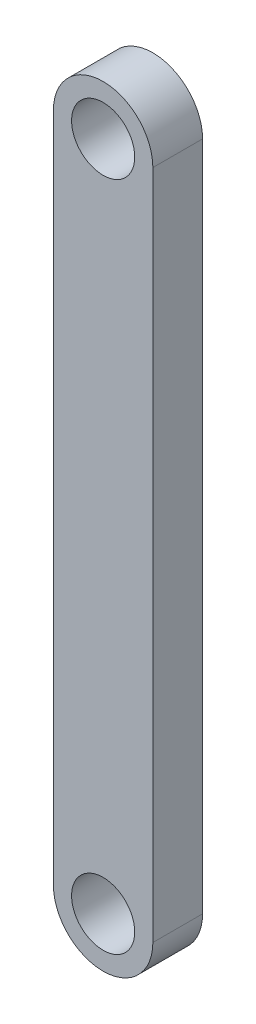
ISO-10303-21;
HEADER;
FILE_DESCRIPTION(('STEP AP214'),'2;1');
FILE_NAME('part.step','',(''),(''),'','','');
FILE_SCHEMA(('AUTOMOTIVE_DESIGN { 1 0 10303 214 1 1 1 1 }'));
ENDSEC;
DATA;
#1=APPLICATION_CONTEXT('core data for automotive mechanical design processes');
#2=APPLICATION_PROTOCOL_DEFINITION('international standard','automotive_design',2000,#1);
#3=PRODUCT_CONTEXT('',#1,'mechanical');
#4=PRODUCT('Part','Part','',(#3));
#5=PRODUCT_RELATED_PRODUCT_CATEGORY('part','',(#4));
#6=PRODUCT_DEFINITION_FORMATION('','',#4);
#7=PRODUCT_DEFINITION_CONTEXT('part definition',#1,'design');
#8=PRODUCT_DEFINITION('design','',#6,#7);
#9=PRODUCT_DEFINITION_SHAPE('','',#8);
#10=(LENGTH_UNIT() NAMED_UNIT(*) SI_UNIT(.MILLI.,.METRE.));
#11=(NAMED_UNIT(*) PLANE_ANGLE_UNIT() SI_UNIT($,.RADIAN.));
#12=(NAMED_UNIT(*) SI_UNIT($,.STERADIAN.) SOLID_ANGLE_UNIT());
#13=UNCERTAINTY_MEASURE_WITH_UNIT(LENGTH_MEASURE(1.E-05),#10,'distance_accuracy_value','');
#14=(GEOMETRIC_REPRESENTATION_CONTEXT(3) GLOBAL_UNCERTAINTY_ASSIGNED_CONTEXT((#13)) GLOBAL_UNIT_ASSIGNED_CONTEXT((#10,
#11,#12)) REPRESENTATION_CONTEXT('',''));
#15=CARTESIAN_POINT('',(0.,0.,0.));
#16=DIRECTION('',(0.,0.,1.));
#17=DIRECTION('',(1.,0.,0.));
#18=AXIS2_PLACEMENT_3D('',#15,#16,#17);
#19=CARTESIAN_POINT('',(0.,0.,10.));
#20=DIRECTION('',(0.,0.,-1.));
#21=DIRECTION('',(-1.,0.,0.));
#22=AXIS2_PLACEMENT_3D('',#19,#20,#21);
#23=CYLINDRICAL_SURFACE('',#22,10.);
#24=CARTESIAN_POINT('',(0.,0.,0.));
#25=DIRECTION('',(0.,0.,1.));
#26=DIRECTION('',(1.,0.,0.));
#27=AXIS2_PLACEMENT_3D('',#24,#25,#26);
#28=CIRCLE('',#27,10.);
#29=CARTESIAN_POINT('',(-10.,0.,0.));
#30=VERTEX_POINT('',#29);
#31=CARTESIAN_POINT('',(10.,0.,0.));
#32=VERTEX_POINT('',#31);
#33=EDGE_CURVE('E96',#30,#32,#28,.T.);
#34=ORIENTED_EDGE('',*,*,#33,.T.);
#35=DIRECTION('',(0.,0.,-1.));
#36=VECTOR('',#35,1.);
#37=CARTESIAN_POINT('',(10.,0.,10.));
#38=LINE('',#37,#36);
#39=CARTESIAN_POINT('',(10.,0.,10.));
#40=VERTEX_POINT('',#39);
#41=EDGE_CURVE('E11',#40,#32,#38,.T.);
#42=ORIENTED_EDGE('',*,*,#41,.F.);
#43=CARTESIAN_POINT('',(0.,0.,10.));
#44=DIRECTION('',(0.,0.,1.));
#45=DIRECTION('',(1.,0.,0.));
#46=AXIS2_PLACEMENT_3D('',#43,#44,#45);
#47=CIRCLE('',#46,10.);
#48=CARTESIAN_POINT('',(-10.,0.,10.));
#49=VERTEX_POINT('',#48);
#50=EDGE_CURVE('E84',#49,#40,#47,.T.);
#51=ORIENTED_EDGE('',*,*,#50,.F.);
#52=DIRECTION('',(0.,0.,-1.));
#53=VECTOR('',#52,1.);
#54=CARTESIAN_POINT('',(-10.,0.,10.));
#55=LINE('',#54,#53);
#56=EDGE_CURVE('E92',#49,#30,#55,.T.);
#57=ORIENTED_EDGE('',*,*,#56,.T.);
#58=EDGE_LOOP('',(#34,#42,#51,#57));
#59=FACE_BOUND('',#58,.T.);
#60=ADVANCED_FACE('F33',(#59),#23,.T.);
#61=CARTESIAN_POINT('',(10.,0.,10.));
#62=DIRECTION('',(-1.,0.,0.));
#63=DIRECTION('',(0.,0.,1.));
#64=AXIS2_PLACEMENT_3D('',#61,#62,#63);
#65=PLANE('',#64);
#66=DIRECTION('',(0.,1.,0.));
#67=VECTOR('',#66,1.);
#68=CARTESIAN_POINT('',(10.,0.,0.));
#69=LINE('',#68,#67);
#70=CARTESIAN_POINT('',(10.,135.,0.));
#71=VERTEX_POINT('',#70);
#72=EDGE_CURVE('E88',#32,#71,#69,.T.);
#73=ORIENTED_EDGE('',*,*,#72,.T.);
#74=DIRECTION('',(0.,0.,-1.));
#75=VECTOR('',#74,1.);
#76=CARTESIAN_POINT('',(10.,135.,10.));
#77=LINE('',#76,#75);
#78=CARTESIAN_POINT('',(10.,135.,10.));
#79=VERTEX_POINT('',#78);
#80=EDGE_CURVE('E41',#79,#71,#77,.T.);
#81=ORIENTED_EDGE('',*,*,#80,.F.);
#82=DIRECTION('',(0.,1.,0.));
#83=VECTOR('',#82,1.);
#84=CARTESIAN_POINT('',(10.,0.,10.));
#85=LINE('',#84,#83);
#86=EDGE_CURVE('E79',#40,#79,#85,.T.);
#87=ORIENTED_EDGE('',*,*,#86,.F.);
#88=ORIENTED_EDGE('',*,*,#41,.T.);
#89=EDGE_LOOP('',(#73,#81,#87,#88));
#90=FACE_BOUND('',#89,.T.);
#91=ADVANCED_FACE('F87',(#90),#65,.F.);
#92=CARTESIAN_POINT('',(0.,135.,10.));
#93=DIRECTION('',(0.,0.,-1.));
#94=DIRECTION('',(-1.,0.,0.));
#95=AXIS2_PLACEMENT_3D('',#92,#93,#94);
#96=CYLINDRICAL_SURFACE('',#95,10.);
#97=CARTESIAN_POINT('',(0.,135.,0.));
#98=DIRECTION('',(0.,0.,1.));
#99=DIRECTION('',(1.,0.,0.));
#100=AXIS2_PLACEMENT_3D('',#97,#98,#99);
#101=CIRCLE('',#100,10.);
#102=CARTESIAN_POINT('',(-10.,135.,0.));
#103=VERTEX_POINT('',#102);
#104=EDGE_CURVE('E66',#71,#103,#101,.T.);
#105=ORIENTED_EDGE('',*,*,#104,.T.);
#106=DIRECTION('',(0.,0.,-1.));
#107=VECTOR('',#106,1.);
#108=CARTESIAN_POINT('',(-10.,135.,10.));
#109=LINE('',#108,#107);
#110=CARTESIAN_POINT('',(-10.,135.,10.));
#111=VERTEX_POINT('',#110);
#112=EDGE_CURVE('E89',#111,#103,#109,.T.);
#113=ORIENTED_EDGE('',*,*,#112,.F.);
#114=CARTESIAN_POINT('',(0.,135.,10.));
#115=DIRECTION('',(0.,0.,1.));
#116=DIRECTION('',(1.,0.,0.));
#117=AXIS2_PLACEMENT_3D('',#114,#115,#116);
#118=CIRCLE('',#117,10.);
#119=EDGE_CURVE('E82',#79,#111,#118,.T.);
#120=ORIENTED_EDGE('',*,*,#119,.F.);
#121=ORIENTED_EDGE('',*,*,#80,.T.);
#122=EDGE_LOOP('',(#105,#113,#120,#121));
#123=FACE_BOUND('',#122,.T.);
#124=ADVANCED_FACE('F90',(#123),#96,.T.);
#125=CARTESIAN_POINT('',(-10.,0.,10.));
#126=DIRECTION('',(1.,0.,0.));
#127=DIRECTION('',(0.,0.,-1.));
#128=AXIS2_PLACEMENT_3D('',#125,#126,#127);
#129=PLANE('',#128);
#130=DIRECTION('',(0.,-1.,0.));
#131=VECTOR('',#130,1.);
#132=CARTESIAN_POINT('',(-10.,0.,0.));
#133=LINE('',#132,#131);
#134=EDGE_CURVE('E72',#103,#30,#133,.T.);
#135=ORIENTED_EDGE('',*,*,#134,.T.);
#136=ORIENTED_EDGE('',*,*,#56,.F.);
#137=DIRECTION('',(0.,-1.,0.));
#138=VECTOR('',#137,1.);
#139=CARTESIAN_POINT('',(-10.,0.,10.));
#140=LINE('',#139,#138);
#141=EDGE_CURVE('E49',#111,#49,#140,.T.);
#142=ORIENTED_EDGE('',*,*,#141,.F.);
#143=ORIENTED_EDGE('',*,*,#112,.T.);
#144=EDGE_LOOP('',(#135,#136,#142,#143));
#145=FACE_BOUND('',#144,.T.);
#146=ADVANCED_FACE('F104',(#145),#129,.F.);
#147=CARTESIAN_POINT('',(0.,0.,10.));
#148=DIRECTION('',(0.,0.,1.));
#149=DIRECTION('',(1.,0.,0.));
#150=AXIS2_PLACEMENT_3D('',#147,#148,#149);
#151=PLANE('',#150);
#152=CARTESIAN_POINT('',(0.,135.,10.));
#153=DIRECTION('',(0.,0.,1.));
#154=DIRECTION('',(1.,0.,0.));
#155=AXIS2_PLACEMENT_3D('',#152,#153,#154);
#156=CIRCLE('',#155,6.34999999999999);
#157=CARTESIAN_POINT('',(6.34999999999999,135.,10.));
#158=VERTEX_POINT('',#157);
#159=EDGE_CURVE('E116',#158,#158,#156,.T.);
#160=ORIENTED_EDGE('',*,*,#159,.F.);
#161=EDGE_LOOP('',(#160));
#162=FACE_BOUND('',#161,.T.);
#163=CARTESIAN_POINT('',(0.,0.,10.));
#164=DIRECTION('',(0.,0.,1.));
#165=DIRECTION('',(1.,0.,0.));
#166=AXIS2_PLACEMENT_3D('',#163,#164,#165);
#167=CIRCLE('',#166,6.35);
#168=CARTESIAN_POINT('',(6.35,0.,10.));
#169=VERTEX_POINT('',#168);
#170=EDGE_CURVE('E110',#169,#169,#167,.T.);
#171=ORIENTED_EDGE('',*,*,#170,.F.);
#172=EDGE_LOOP('',(#171));
#173=FACE_BOUND('',#172,.T.);
#174=ORIENTED_EDGE('',*,*,#50,.T.);
#175=ORIENTED_EDGE('',*,*,#86,.T.);
#176=ORIENTED_EDGE('',*,*,#119,.T.);
#177=ORIENTED_EDGE('',*,*,#141,.T.);
#178=EDGE_LOOP('',(#174,#175,#176,#177));
#179=FACE_BOUND('',#178,.T.);
#180=ADVANCED_FACE('F80',(#162,#173,#179),#151,.T.);
#181=CARTESIAN_POINT('',(0.,0.,0.));
#182=DIRECTION('',(0.,0.,1.));
#183=DIRECTION('',(1.,0.,0.));
#184=AXIS2_PLACEMENT_3D('',#181,#182,#183);
#185=PLANE('',#184);
#186=CARTESIAN_POINT('',(0.,135.,0.));
#187=DIRECTION('',(0.,0.,1.));
#188=DIRECTION('',(1.,0.,0.));
#189=AXIS2_PLACEMENT_3D('',#186,#187,#188);
#190=CIRCLE('',#189,6.34999999999999);
#191=CARTESIAN_POINT('',(6.34999999999999,135.,0.));
#192=VERTEX_POINT('',#191);
#193=EDGE_CURVE('E99',#192,#192,#190,.T.);
#194=ORIENTED_EDGE('',*,*,#193,.T.);
#195=EDGE_LOOP('',(#194));
#196=FACE_BOUND('',#195,.T.);
#197=CARTESIAN_POINT('',(0.,0.,0.));
#198=DIRECTION('',(0.,0.,1.));
#199=DIRECTION('',(1.,0.,0.));
#200=AXIS2_PLACEMENT_3D('',#197,#198,#199);
#201=CIRCLE('',#200,6.35);
#202=CARTESIAN_POINT('',(6.35,0.,0.));
#203=VERTEX_POINT('',#202);
#204=EDGE_CURVE('E113',#203,#203,#201,.T.);
#205=ORIENTED_EDGE('',*,*,#204,.T.);
#206=EDGE_LOOP('',(#205));
#207=FACE_BOUND('',#206,.T.);
#208=ORIENTED_EDGE('',*,*,#33,.F.);
#209=ORIENTED_EDGE('',*,*,#134,.F.);
#210=ORIENTED_EDGE('',*,*,#104,.F.);
#211=ORIENTED_EDGE('',*,*,#72,.F.);
#212=EDGE_LOOP('',(#208,#209,#210,#211));
#213=FACE_BOUND('',#212,.T.);
#214=ADVANCED_FACE('F107',(#196,#207,#213),#185,.F.);
#215=CARTESIAN_POINT('',(0.,0.,0.));
#216=DIRECTION('',(0.,0.,1.));
#217=DIRECTION('',(1.,0.,0.));
#218=AXIS2_PLACEMENT_3D('',#215,#216,#217);
#219=CYLINDRICAL_SURFACE('',#218,6.35);
#220=ORIENTED_EDGE('',*,*,#204,.F.);
#221=EDGE_LOOP('',(#220));
#222=FACE_BOUND('',#221,.T.);
#223=ORIENTED_EDGE('',*,*,#170,.T.);
#224=EDGE_LOOP('',(#223));
#225=FACE_BOUND('',#224,.T.);
#226=ADVANCED_FACE('F127',(#222,#225),#219,.F.);
#227=CARTESIAN_POINT('',(0.,135.,0.));
#228=DIRECTION('',(0.,0.,1.));
#229=DIRECTION('',(1.,0.,0.));
#230=AXIS2_PLACEMENT_3D('',#227,#228,#229);
#231=CYLINDRICAL_SURFACE('',#230,6.34999999999999);
#232=ORIENTED_EDGE('',*,*,#193,.F.);
#233=EDGE_LOOP('',(#232));
#234=FACE_BOUND('',#233,.T.);
#235=ORIENTED_EDGE('',*,*,#159,.T.);
#236=EDGE_LOOP('',(#235));
#237=FACE_BOUND('',#236,.T.);
#238=ADVANCED_FACE('F124',(#234,#237),#231,.F.);
#239=CLOSED_SHELL('',(#60,#91,#124,#146,#180,#214,#226,#238));
#240=MANIFOLD_SOLID_BREP('B2',#239);
#241=ADVANCED_BREP_SHAPE_REPRESENTATION('',(#18,#240),#14);
#242=SHAPE_DEFINITION_REPRESENTATION(#9,#241);
ENDSEC;
END-ISO-10303-21;
